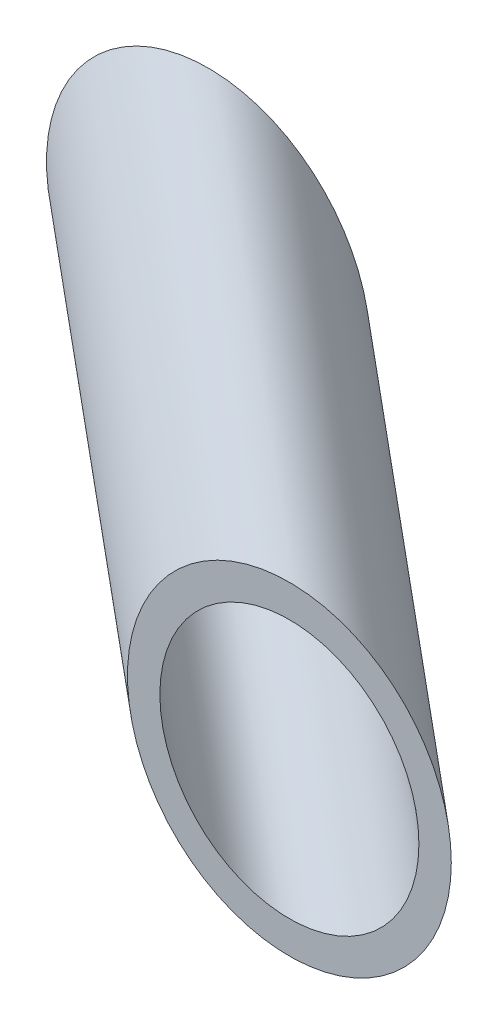
ISO-10303-21;
HEADER;
FILE_DESCRIPTION(('STEP AP214'),'2;1');
FILE_NAME('part.step','',(''),(''),'','','');
FILE_SCHEMA(('AUTOMOTIVE_DESIGN { 1 0 10303 214 1 1 1 1 }'));
ENDSEC;
DATA;
#1=APPLICATION_CONTEXT('core data for automotive mechanical design processes');
#2=APPLICATION_PROTOCOL_DEFINITION('international standard','automotive_design',2000,#1);
#3=PRODUCT_CONTEXT('',#1,'mechanical');
#4=PRODUCT('Part','Part','',(#3));
#5=PRODUCT_RELATED_PRODUCT_CATEGORY('part','',(#4));
#6=PRODUCT_DEFINITION_FORMATION('','',#4);
#7=PRODUCT_DEFINITION_CONTEXT('part definition',#1,'design');
#8=PRODUCT_DEFINITION('design','',#6,#7);
#9=PRODUCT_DEFINITION_SHAPE('','',#8);
#10=(LENGTH_UNIT() NAMED_UNIT(*) SI_UNIT(.MILLI.,.METRE.));
#11=(NAMED_UNIT(*) PLANE_ANGLE_UNIT() SI_UNIT($,.RADIAN.));
#12=(NAMED_UNIT(*) SI_UNIT($,.STERADIAN.) SOLID_ANGLE_UNIT());
#13=UNCERTAINTY_MEASURE_WITH_UNIT(LENGTH_MEASURE(1.E-05),#10,'distance_accuracy_value','');
#14=(GEOMETRIC_REPRESENTATION_CONTEXT(3) GLOBAL_UNCERTAINTY_ASSIGNED_CONTEXT((#13)) GLOBAL_UNIT_ASSIGNED_CONTEXT((#10,
#11,#12)) REPRESENTATION_CONTEXT('',''));
#15=CARTESIAN_POINT('',(0.,0.,0.));
#16=DIRECTION('',(0.,0.,1.));
#17=DIRECTION('',(1.,0.,0.));
#18=AXIS2_PLACEMENT_3D('',#15,#16,#17);
#19=CARTESIAN_POINT('',(38.1,0.,31.75));
#20=DIRECTION('',(0.,0.,1.));
#21=DIRECTION('',(1.,0.,0.));
#22=AXIS2_PLACEMENT_3D('',#19,#20,#21);
#23=CIRCLE('',#22,10.16);
#24=DIRECTION('',(-0.768221279597376,0.,-0.64018439966448));
#25=VECTOR('',#24,1.);
#26=SURFACE_OF_LINEAR_EXTRUSION('',#23,#25);
#27=CARTESIAN_POINT('',(48.26,0.,31.75));
#28=VERTEX_POINT('',#27);
#29=EDGE_CURVE('E39',#28,#28,#23,.T.);
#30=ORIENTED_EDGE('',*,*,#29,.T.);
#31=EDGE_LOOP('',(#30));
#32=FACE_BOUND('',#31,.T.);
#33=CARTESIAN_POINT('',(0.,0.,0.));
#34=DIRECTION('',(0.,0.,1.));
#35=DIRECTION('',(1.,0.,0.));
#36=AXIS2_PLACEMENT_3D('',#33,#34,#35);
#37=CIRCLE('',#36,10.16);
#38=CARTESIAN_POINT('',(10.16,0.,0.));
#39=VERTEX_POINT('',#38);
#40=EDGE_CURVE('E46',#39,#39,#37,.T.);
#41=ORIENTED_EDGE('',*,*,#40,.F.);
#42=EDGE_LOOP('',(#41));
#43=FACE_BOUND('',#42,.T.);
#44=ADVANCED_FACE('F31',(#32,#43),#26,.T.);
#45=CARTESIAN_POINT('',(38.1,0.,31.75));
#46=DIRECTION('',(0.,0.,1.));
#47=DIRECTION('',(1.,0.,0.));
#48=AXIS2_PLACEMENT_3D('',#45,#46,#47);
#49=CIRCLE('',#48,12.7);
#50=DIRECTION('',(-0.768221279597376,0.,-0.64018439966448));
#51=VECTOR('',#50,1.);
#52=SURFACE_OF_LINEAR_EXTRUSION('',#49,#51);
#53=CARTESIAN_POINT('',(50.8,0.,31.75));
#54=VERTEX_POINT('',#53);
#55=EDGE_CURVE('E10',#54,#54,#49,.T.);
#56=ORIENTED_EDGE('',*,*,#55,.F.);
#57=EDGE_LOOP('',(#56));
#58=FACE_BOUND('',#57,.T.);
#59=CARTESIAN_POINT('',(0.,0.,0.));
#60=DIRECTION('',(0.,0.,1.));
#61=DIRECTION('',(1.,0.,0.));
#62=AXIS2_PLACEMENT_3D('',#59,#60,#61);
#63=CIRCLE('',#62,12.7);
#64=CARTESIAN_POINT('',(12.7,0.,0.));
#65=VERTEX_POINT('',#64);
#66=EDGE_CURVE('E35',#65,#65,#63,.T.);
#67=ORIENTED_EDGE('',*,*,#66,.T.);
#68=EDGE_LOOP('',(#67));
#69=FACE_BOUND('',#68,.T.);
#70=ADVANCED_FACE('F47',(#58,#69),#52,.F.);
#71=CARTESIAN_POINT('',(38.1,0.,31.75));
#72=DIRECTION('',(0.,0.,1.));
#73=DIRECTION('',(1.,0.,0.));
#74=AXIS2_PLACEMENT_3D('',#71,#72,#73);
#75=PLANE('',#74);
#76=ORIENTED_EDGE('',*,*,#29,.F.);
#77=EDGE_LOOP('',(#76));
#78=FACE_BOUND('',#77,.T.);
#79=ORIENTED_EDGE('',*,*,#55,.T.);
#80=EDGE_LOOP('',(#79));
#81=FACE_BOUND('',#80,.T.);
#82=ADVANCED_FACE('F50',(#78,#81),#75,.T.);
#83=CARTESIAN_POINT('',(0.,0.,0.));
#84=DIRECTION('',(0.,0.,1.));
#85=DIRECTION('',(1.,0.,0.));
#86=AXIS2_PLACEMENT_3D('',#83,#84,#85);
#87=PLANE('',#86);
#88=ORIENTED_EDGE('',*,*,#40,.T.);
#89=EDGE_LOOP('',(#88));
#90=FACE_BOUND('',#89,.T.);
#91=ORIENTED_EDGE('',*,*,#66,.F.);
#92=EDGE_LOOP('',(#91));
#93=FACE_BOUND('',#92,.T.);
#94=ADVANCED_FACE('F52',(#90,#93),#87,.F.);
#95=CLOSED_SHELL('',(#44,#70,#82,#94));
#96=MANIFOLD_SOLID_BREP('B2',#95);
#97=ADVANCED_BREP_SHAPE_REPRESENTATION('',(#18,#96),#14);
#98=SHAPE_DEFINITION_REPRESENTATION(#9,#97);
ENDSEC;
END-ISO-10303-21;
